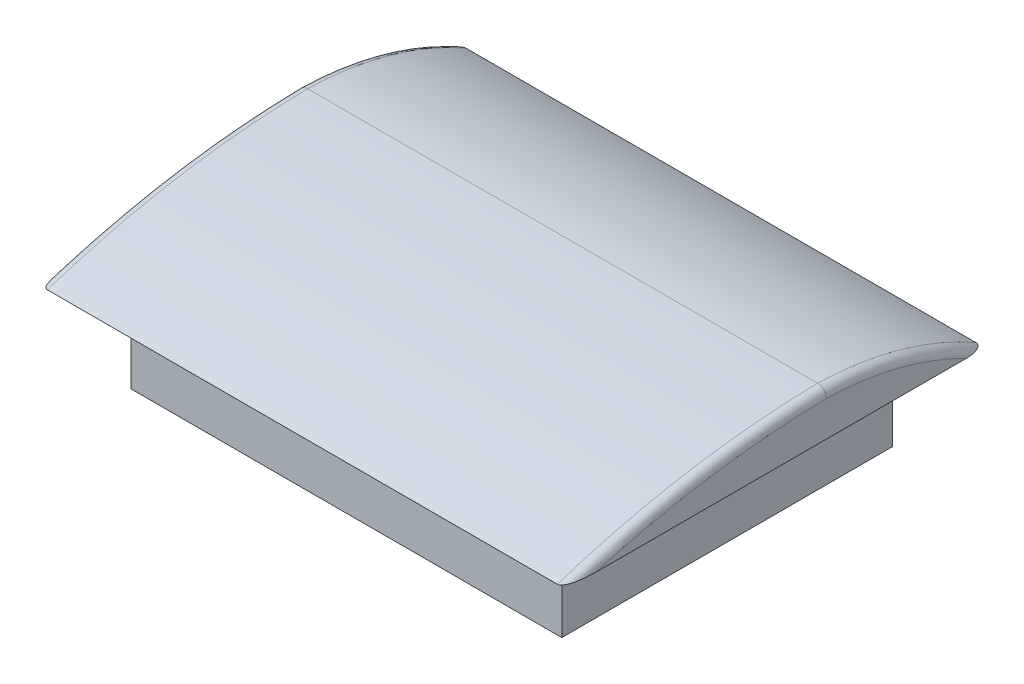
ISO-10303-21;
HEADER;
FILE_DESCRIPTION(('STEP AP214'),'2;1');
FILE_NAME('part.step','',(''),(''),'','','');
FILE_SCHEMA(('AUTOMOTIVE_DESIGN { 1 0 10303 214 1 1 1 1 }'));
ENDSEC;
DATA;
#1=APPLICATION_CONTEXT('core data for automotive mechanical design processes');
#2=APPLICATION_PROTOCOL_DEFINITION('international standard','automotive_design',2000,#1);
#3=PRODUCT_CONTEXT('',#1,'mechanical');
#4=PRODUCT('Part','Part','',(#3));
#5=PRODUCT_RELATED_PRODUCT_CATEGORY('part','',(#4));
#6=PRODUCT_DEFINITION_FORMATION('','',#4);
#7=PRODUCT_DEFINITION_CONTEXT('part definition',#1,'design');
#8=PRODUCT_DEFINITION('design','',#6,#7);
#9=PRODUCT_DEFINITION_SHAPE('','',#8);
#10=(LENGTH_UNIT() NAMED_UNIT(*) SI_UNIT(.MILLI.,.METRE.));
#11=(NAMED_UNIT(*) PLANE_ANGLE_UNIT() SI_UNIT($,.RADIAN.));
#12=(NAMED_UNIT(*) SI_UNIT($,.STERADIAN.) SOLID_ANGLE_UNIT());
#13=UNCERTAINTY_MEASURE_WITH_UNIT(LENGTH_MEASURE(1.E-05),#10,'distance_accuracy_value','');
#14=(GEOMETRIC_REPRESENTATION_CONTEXT(3) GLOBAL_UNCERTAINTY_ASSIGNED_CONTEXT((#13)) GLOBAL_UNIT_ASSIGNED_CONTEXT((#10,
#11,#12)) REPRESENTATION_CONTEXT('',''));
#15=CARTESIAN_POINT('',(0.,0.,0.));
#16=DIRECTION('',(0.,0.,1.));
#17=DIRECTION('',(1.,0.,0.));
#18=AXIS2_PLACEMENT_3D('',#15,#16,#17);
#19=CARTESIAN_POINT('',(-62.23,25.4,50.8));
#20=DIRECTION('',(1.,0.,0.));
#21=DIRECTION('',(0.,0.,-1.));
#22=AXIS2_PLACEMENT_3D('',#19,#20,#21);
#23=PLANE('',#22);
#24=DIRECTION('',(0.,0.,1.));
#25=VECTOR('',#24,1.);
#26=CARTESIAN_POINT('',(-62.23,0.,50.8));
#27=LINE('',#26,#25);
#28=CARTESIAN_POINT('',(-62.23,0.,-44.704));
#29=VERTEX_POINT('',#28);
#30=CARTESIAN_POINT('',(-62.23,0.,50.8));
#31=VERTEX_POINT('',#30);
#32=EDGE_CURVE('E218',#29,#31,#27,.T.);
#33=ORIENTED_EDGE('',*,*,#32,.T.);
#34=DIRECTION('',(0.,-1.,0.));
#35=VECTOR('',#34,1.);
#36=CARTESIAN_POINT('',(-62.23,25.4,50.8));
#37=LINE('',#36,#35);
#38=CARTESIAN_POINT('',(-62.23,25.4,50.8));
#39=VERTEX_POINT('',#38);
#40=EDGE_CURVE('E264',#39,#31,#37,.T.);
#41=ORIENTED_EDGE('',*,*,#40,.F.);
#42=DIRECTION('',(0.,0.,1.));
#43=VECTOR('',#42,1.);
#44=CARTESIAN_POINT('',(-62.23,25.4,50.8));
#45=LINE('',#44,#43);
#46=CARTESIAN_POINT('',(-62.23,25.4,-44.704));
#47=VERTEX_POINT('',#46);
#48=EDGE_CURVE('E224',#47,#39,#45,.T.);
#49=ORIENTED_EDGE('',*,*,#48,.F.);
#50=DIRECTION('',(0.,-1.,0.));
#51=VECTOR('',#50,1.);
#52=CARTESIAN_POINT('',(-62.23,25.4,-44.704));
#53=LINE('',#52,#51);
#54=EDGE_CURVE('E241',#47,#29,#53,.T.);
#55=ORIENTED_EDGE('',*,*,#54,.T.);
#56=EDGE_LOOP('',(#33,#41,#49,#55));
#57=FACE_BOUND('',#56,.T.);
#58=ADVANCED_FACE('F41',(#57),#23,.F.);
#59=CARTESIAN_POINT('',(-62.23,25.4,50.8));
#60=DIRECTION('',(0.,0.,-1.));
#61=DIRECTION('',(-1.,0.,0.));
#62=AXIS2_PLACEMENT_3D('',#59,#60,#61);
#63=PLANE('',#62);
#64=DIRECTION('',(1.,0.,0.));
#65=VECTOR('',#64,1.);
#66=CARTESIAN_POINT('',(-62.23,0.,50.8));
#67=LINE('',#66,#65);
#68=CARTESIAN_POINT('',(62.23,0.,50.8));
#69=VERTEX_POINT('',#68);
#70=EDGE_CURVE('E245',#31,#69,#67,.T.);
#71=ORIENTED_EDGE('',*,*,#70,.T.);
#72=DIRECTION('',(0.,-1.,0.));
#73=VECTOR('',#72,1.);
#74=CARTESIAN_POINT('',(62.23,25.4,50.8));
#75=LINE('',#74,#73);
#76=CARTESIAN_POINT('',(62.23,25.4,50.8));
#77=VERTEX_POINT('',#76);
#78=EDGE_CURVE('E260',#77,#69,#75,.T.);
#79=ORIENTED_EDGE('',*,*,#78,.F.);
#80=DIRECTION('',(1.,0.,0.));
#81=VECTOR('',#80,1.);
#82=CARTESIAN_POINT('',(-62.23,25.4,50.8));
#83=LINE('',#82,#81);
#84=EDGE_CURVE('E228',#39,#77,#83,.T.);
#85=ORIENTED_EDGE('',*,*,#84,.F.);
#86=ORIENTED_EDGE('',*,*,#40,.T.);
#87=EDGE_LOOP('',(#71,#79,#85,#86));
#88=FACE_BOUND('',#87,.T.);
#89=ADVANCED_FACE('F348',(#88),#63,.F.);
#90=CARTESIAN_POINT('',(62.23,25.4,50.8));
#91=DIRECTION('',(-1.,0.,0.));
#92=DIRECTION('',(0.,0.,1.));
#93=AXIS2_PLACEMENT_3D('',#90,#91,#92);
#94=PLANE('',#93);
#95=DIRECTION('',(0.,0.,-1.));
#96=VECTOR('',#95,1.);
#97=CARTESIAN_POINT('',(62.23,0.,50.8));
#98=LINE('',#97,#96);
#99=CARTESIAN_POINT('',(62.23,0.,-44.704));
#100=VERTEX_POINT('',#99);
#101=EDGE_CURVE('E248',#69,#100,#98,.T.);
#102=ORIENTED_EDGE('',*,*,#101,.T.);
#103=DIRECTION('',(0.,-1.,0.));
#104=VECTOR('',#103,1.);
#105=CARTESIAN_POINT('',(62.23,25.4,-44.704));
#106=LINE('',#105,#104);
#107=CARTESIAN_POINT('',(62.23,25.4,-44.704));
#108=VERTEX_POINT('',#107);
#109=EDGE_CURVE('E256',#108,#100,#106,.T.);
#110=ORIENTED_EDGE('',*,*,#109,.F.);
#111=DIRECTION('',(0.,0.,-1.));
#112=VECTOR('',#111,1.);
#113=CARTESIAN_POINT('',(62.23,25.4,50.8));
#114=LINE('',#113,#112);
#115=EDGE_CURVE('E233',#77,#108,#114,.T.);
#116=ORIENTED_EDGE('',*,*,#115,.F.);
#117=ORIENTED_EDGE('',*,*,#78,.T.);
#118=EDGE_LOOP('',(#102,#110,#116,#117));
#119=FACE_BOUND('',#118,.T.);
#120=ADVANCED_FACE('F353',(#119),#94,.F.);
#121=CARTESIAN_POINT('',(-62.23,25.4,-44.704));
#122=DIRECTION('',(0.,0.,1.));
#123=DIRECTION('',(1.,0.,0.));
#124=AXIS2_PLACEMENT_3D('',#121,#122,#123);
#125=PLANE('',#124);
#126=DIRECTION('',(-1.,0.,0.));
#127=VECTOR('',#126,1.);
#128=CARTESIAN_POINT('',(-62.23,0.,-44.704));
#129=LINE('',#128,#127);
#130=EDGE_CURVE('E229',#100,#29,#129,.T.);
#131=ORIENTED_EDGE('',*,*,#130,.T.);
#132=ORIENTED_EDGE('',*,*,#54,.F.);
#133=DIRECTION('',(-1.,0.,0.));
#134=VECTOR('',#133,1.);
#135=CARTESIAN_POINT('',(-62.23,25.4,-44.704));
#136=LINE('',#135,#134);
#137=EDGE_CURVE('E237',#108,#47,#136,.T.);
#138=ORIENTED_EDGE('',*,*,#137,.F.);
#139=ORIENTED_EDGE('',*,*,#109,.T.);
#140=EDGE_LOOP('',(#131,#132,#138,#139));
#141=FACE_BOUND('',#140,.T.);
#142=ADVANCED_FACE('F367',(#141),#125,.F.);
#143=CARTESIAN_POINT('',(0.,0.,0.));
#144=DIRECTION('',(0.,-1.,0.));
#145=DIRECTION('',(0.,0.,-1.));
#146=AXIS2_PLACEMENT_3D('',#143,#144,#145);
#147=PLANE('',#146);
#148=DIRECTION('',(0.,0.,-1.));
#149=VECTOR('',#148,1.);
#150=CARTESIAN_POINT('',(-57.15,0.,-39.624));
#151=LINE('',#150,#149);
#152=CARTESIAN_POINT('',(-57.15,0.,45.72));
#153=VERTEX_POINT('',#152);
#154=CARTESIAN_POINT('',(-57.15,0.,-39.624));
#155=VERTEX_POINT('',#154);
#156=EDGE_CURVE('E158',#153,#155,#151,.T.);
#157=ORIENTED_EDGE('',*,*,#156,.F.);
#158=DIRECTION('',(-1.,0.,0.));
#159=VECTOR('',#158,1.);
#160=CARTESIAN_POINT('',(-57.15,0.,45.72));
#161=LINE('',#160,#159);
#162=CARTESIAN_POINT('',(57.15,0.,45.72));
#163=VERTEX_POINT('',#162);
#164=EDGE_CURVE('E178',#163,#153,#161,.T.);
#165=ORIENTED_EDGE('',*,*,#164,.F.);
#166=DIRECTION('',(0.,0.,1.));
#167=VECTOR('',#166,1.);
#168=CARTESIAN_POINT('',(57.15,0.,-39.624));
#169=LINE('',#168,#167);
#170=CARTESIAN_POINT('',(57.15,0.,-39.624));
#171=VERTEX_POINT('',#170);
#172=EDGE_CURVE('E182',#171,#163,#169,.T.);
#173=ORIENTED_EDGE('',*,*,#172,.F.);
#174=DIRECTION('',(1.,0.,0.));
#175=VECTOR('',#174,1.);
#176=CARTESIAN_POINT('',(-57.15,0.,-39.624));
#177=LINE('',#176,#175);
#178=EDGE_CURVE('E191',#155,#171,#177,.T.);
#179=ORIENTED_EDGE('',*,*,#178,.F.);
#180=EDGE_LOOP('',(#157,#165,#173,#179));
#181=FACE_BOUND('',#180,.T.);
#182=ORIENTED_EDGE('',*,*,#32,.F.);
#183=ORIENTED_EDGE('',*,*,#130,.F.);
#184=ORIENTED_EDGE('',*,*,#101,.F.);
#185=ORIENTED_EDGE('',*,*,#70,.F.);
#186=EDGE_LOOP('',(#182,#183,#184,#185));
#187=FACE_BOUND('',#186,.T.);
#188=ADVANCED_FACE('F360',(#181,#187),#147,.T.);
#189=CARTESIAN_POINT('',(-76.2,-58.3114177789664,-9.52693950584267));
#190=DIRECTION('',(1.,0.,0.));
#191=DIRECTION('',(0.,0.,-1.));
#192=AXIS2_PLACEMENT_3D('',#189,#190,#191);
#193=CYLINDRICAL_SURFACE('',#192,96.4355452523905);
#194=DIRECTION('',(1.,0.,0.));
#195=VECTOR('',#194,1.);
#196=CARTESIAN_POINT('',(-76.2,25.4,-57.404));
#197=LINE('',#196,#195);
#198=CARTESIAN_POINT('',(-73.66,25.4,-57.404));
#199=VERTEX_POINT('',#198);
#200=CARTESIAN_POINT('',(73.6599999999999,25.4,-57.404));
#201=VERTEX_POINT('',#200);
#202=EDGE_CURVE('E214',#199,#201,#197,.T.);
#203=ORIENTED_EDGE('',*,*,#202,.F.);
#204=CARTESIAN_POINT('',(-73.66,-58.3114177789664,-9.52693950584267));
#205=DIRECTION('',(1.,0.,0.));
#206=DIRECTION('',(0.,0.,-1.));
#207=AXIS2_PLACEMENT_3D('',#204,#205,#206);
#208=CIRCLE('',#207,96.4355452523905);
#209=CARTESIAN_POINT('',(-73.66,38.1,-11.684));
#210=VERTEX_POINT('',#209);
#211=EDGE_CURVE('E318',#199,#210,#208,.T.);
#212=ORIENTED_EDGE('',*,*,#211,.T.);
#213=DIRECTION('',(1.,0.,0.));
#214=VECTOR('',#213,1.);
#215=CARTESIAN_POINT('',(-76.2,38.1,-11.684));
#216=LINE('',#215,#214);
#217=CARTESIAN_POINT('',(73.6599999999999,38.1,-11.684));
#218=VERTEX_POINT('',#217);
#219=EDGE_CURVE('E213',#210,#218,#216,.T.);
#220=ORIENTED_EDGE('',*,*,#219,.T.);
#221=CARTESIAN_POINT('',(73.66,-58.3114177789664,-9.52693950584267));
#222=DIRECTION('',(1.,0.,0.));
#223=DIRECTION('',(0.,0.,-1.));
#224=AXIS2_PLACEMENT_3D('',#221,#222,#223);
#225=CIRCLE('',#224,96.4355452523905);
#226=EDGE_CURVE('E321',#218,#201,#225,.F.);
#227=ORIENTED_EDGE('',*,*,#226,.T.);
#228=EDGE_LOOP('',(#203,#212,#220,#227));
#229=FACE_BOUND('',#228,.T.);
#230=ADVANCED_FACE('F378',(#229),#193,.T.);
#231=CARTESIAN_POINT('',(-76.2,25.4,0.));
#232=DIRECTION('',(0.,-1.,0.));
#233=DIRECTION('',(0.,0.,-1.));
#234=AXIS2_PLACEMENT_3D('',#231,#232,#233);
#235=PLANE('',#234);
#236=ORIENTED_EDGE('',*,*,#137,.T.);
#237=ORIENTED_EDGE('',*,*,#48,.T.);
#238=ORIENTED_EDGE('',*,*,#84,.T.);
#239=ORIENTED_EDGE('',*,*,#115,.T.);
#240=EDGE_LOOP('',(#236,#237,#238,#239));
#241=FACE_BOUND('',#240,.T.);
#242=DIRECTION('',(0.,0.,-1.));
#243=VECTOR('',#242,1.);
#244=CARTESIAN_POINT('',(-76.2,25.4,0.));
#245=LINE('',#244,#243);
#246=CARTESIAN_POINT('',(-76.2,25.4,54.9576947397605));
#247=VERTEX_POINT('',#246);
#248=CARTESIAN_POINT('',(-76.2,25.4,-52.056599176231));
#249=VERTEX_POINT('',#248);
#250=EDGE_CURVE('E209',#247,#249,#245,.T.);
#251=ORIENTED_EDGE('',*,*,#250,.T.);
#252=CARTESIAN_POINT('',(-76.2,25.4,-52.056599176231));
#253=CARTESIAN_POINT('',(-76.199986400252,25.4,-52.2032251436781));
#254=CARTESIAN_POINT('',(-76.1973943485337,25.4,-52.3498596987884));
#255=CARTESIAN_POINT('',(-76.1868281977685,25.4,-52.642975597477));
#256=CARTESIAN_POINT('',(-76.1788525506618,25.4,-52.7894568848455));
#257=CARTESIAN_POINT('',(-76.1572107693455,25.4,-53.0831382041237));
#258=CARTESIAN_POINT('',(-76.1435012678853,25.4,-53.2303350790349));
#259=CARTESIAN_POINT('',(-76.1100505742369,25.4,-53.5240330956672));
#260=CARTESIAN_POINT('',(-76.0903099536138,25.4,-53.6705343019809));
#261=CARTESIAN_POINT('',(-76.0440119410542,25.4,-53.964711740117));
#262=CARTESIAN_POINT('',(-76.0173569484839,25.4,-54.112372742644));
#263=CARTESIAN_POINT('',(-75.9567786041556,25.4,-54.4061931284965));
#264=CARTESIAN_POINT('',(-75.9228560845657,25.4,-54.5523526817391));
#265=CARTESIAN_POINT('',(-75.8470711129189,25.4,-54.8421354805129));
#266=CARTESIAN_POINT('',(-75.8052332376373,25.4,-54.985765111096));
#267=CARTESIAN_POINT('',(-75.7125493171576,25.4,-55.2700535580881));
#268=CARTESIAN_POINT('',(-75.6617082759858,25.4,-55.4107139764506));
#269=CARTESIAN_POINT('',(-75.5782479283947,25.4,-55.6171432916163));
#270=CARTESIAN_POINT('',(-75.5495628345286,25.4,-55.6845138663021));
#271=CARTESIAN_POINT('',(-75.4894993095836,25.4,-55.8180557300682));
#272=CARTESIAN_POINT('',(-75.4581206765914,25.4,-55.8842269287895));
#273=CARTESIAN_POINT('',(-75.3924515813571,25.4,-56.0151115340278));
#274=CARTESIAN_POINT('',(-75.3581613050162,25.4,-56.0798250332819));
#275=CARTESIAN_POINT('',(-75.2864125143503,25.4,-56.2074632544799));
#276=CARTESIAN_POINT('',(-75.2489540964619,25.4,-56.2703880307938));
#277=CARTESIAN_POINT('',(-75.1306901870741,25.4,-56.4570402151161));
#278=CARTESIAN_POINT('',(-75.0445599632672,25.4,-56.5774879256644));
#279=CARTESIAN_POINT('',(-74.8555384563441,25.4,-56.80448824619));
#280=CARTESIAN_POINT('',(-74.7526913753097,25.4,-56.911076200881));
#281=CARTESIAN_POINT('',(-74.5740283597699,25.4,-57.0625492670767));
#282=CARTESIAN_POINT('',(-74.5044808162744,25.4,-57.1147869775542));
#283=CARTESIAN_POINT('',(-74.358564110955,25.4,-57.208833796942));
#284=CARTESIAN_POINT('',(-74.2821997504608,25.4,-57.2506501684809));
#285=CARTESIAN_POINT('',(-74.1335053219032,25.4,-57.3162936437969));
#286=CARTESIAN_POINT('',(-74.0618922265332,25.4,-57.3417297979848));
#287=CARTESIAN_POINT('',(-73.9154627121127,25.4,-57.3802119967774));
#288=CARTESIAN_POINT('',(-73.8406549478061,25.4,-57.3932895415435));
#289=CARTESIAN_POINT('',(-73.7478599134495,25.4,-57.4010623531309));
#290=CARTESIAN_POINT('',(-73.7303006713412,25.4,-57.4021634293166));
#291=CARTESIAN_POINT('',(-73.6951629735922,25.4,-57.4036312489531));
#292=CARTESIAN_POINT('',(-73.6775845379439,25.4,-57.4039984707334));
#293=CARTESIAN_POINT('',(-73.66,25.4,-57.404));
#294=B_SPLINE_CURVE_WITH_KNOTS('',3,(#252,#253,#254,#255,#256,#257,#258,#259,#260,#261,#262,
#263,#264,#265,#266,#267,#268,#269,#270,#271,#272,#273,#274,#275,#276,#277,#278,#279,#280,#281,
#282,#283,#284,#285,#286,#287,#288,#289,#290,#291,#292,#293),.UNSPECIFIED.,.F.,.F.,(4,2,2,2,2,2,
2,2,2,2,2,2,2,2,2,2,2,2,2,2,4),(0.,0.439868125947527,0.879862790443707,1.3232472611938,
1.76658972572489,2.21656742173585,2.66649362056557,3.11504509152921,3.56334803230792,
3.782969266721,4.00260697880471,4.22223067809515,4.44184769455516,4.88492489793763,
5.32684904272928,5.58710271527851,5.84717450671704,6.0742570445478,6.30075921091763,
6.35353123589889,6.40626885261203),.UNSPECIFIED.);
#295=EDGE_CURVE('E325',#249,#199,#294,.T.);
#296=ORIENTED_EDGE('',*,*,#295,.T.);
#297=ORIENTED_EDGE('',*,*,#202,.T.);
#298=CARTESIAN_POINT('',(73.66,25.4,-57.404));
#299=CARTESIAN_POINT('',(73.6981578135602,25.4,-57.4040100133113));
#300=CARTESIAN_POINT('',(73.7362953719906,25.4,-57.4022668428809));
#301=CARTESIAN_POINT('',(73.8122237865294,25.4,-57.3953746143498));
#302=CARTESIAN_POINT('',(73.8500149534366,25.4,-57.3902289920787));
#303=CARTESIAN_POINT('',(73.9617123540981,25.4,-57.3699809738793));
#304=CARTESIAN_POINT('',(74.0347810984086,25.4,-57.3500625916669));
#305=CARTESIAN_POINT('',(74.1928935512286,25.4,-57.2932270381356));
#306=CARTESIAN_POINT('',(74.2769007446166,25.4,-57.2534814031969));
#307=CARTESIAN_POINT('',(74.4375749770849,25.4,-57.1608467940455));
#308=CARTESIAN_POINT('',(74.5142092051941,25.4,-57.1079025228635));
#309=CARTESIAN_POINT('',(74.6984022316067,25.4,-56.9616761791218));
#310=CARTESIAN_POINT('',(74.8007609899678,25.4,-56.8619070877978));
#311=CARTESIAN_POINT('',(74.9893610092658,25.4,-56.6483611657601));
#312=CARTESIAN_POINT('',(75.0755724348627,25.4,-56.5345590370428));
#313=CARTESIAN_POINT('',(75.2277443312366,25.4,-56.307833620905));
#314=CARTESIAN_POINT('',(75.2947940732708,25.4,-56.1956285659566));
#315=CARTESIAN_POINT('',(75.4191535263549,25.4,-55.9658883564525));
#316=CARTESIAN_POINT('',(75.4764548956137,25.4,-55.8483487449112));
#317=CARTESIAN_POINT('',(75.5828769635718,25.4,-55.6088801358254));
#318=CARTESIAN_POINT('',(75.6319504609353,25.4,-55.4869303859529));
#319=CARTESIAN_POINT('',(75.7225660382577,25.4,-55.2403314744805));
#320=CARTESIAN_POINT('',(75.7641104186081,25.4,-55.1156831504575));
#321=CARTESIAN_POINT('',(75.8387997774012,25.4,-54.8699890933601));
#322=CARTESIAN_POINT('',(75.8722373539281,25.4,-54.7490316314782));
#323=CARTESIAN_POINT('',(75.9335710932727,25.4,-54.5057143424611));
#324=CARTESIAN_POINT('',(75.9614663031451,25.4,-54.3833542779834));
#325=CARTESIAN_POINT('',(76.0375970032001,25.4,-54.0144069711077));
#326=CARTESIAN_POINT('',(76.0782020872765,25.4,-53.7662092800775));
#327=CARTESIAN_POINT('',(76.1253506722401,25.4,-53.3957433184515));
#328=CARTESIAN_POINT('',(76.1386775812198,25.4,-53.2742619445378));
#329=CARTESIAN_POINT('',(76.1613290762052,25.4,-53.0309125754713));
#330=CARTESIAN_POINT('',(76.1706535224922,25.4,-52.9090445669713));
#331=CARTESIAN_POINT('',(76.1854476665087,25.4,-52.6654602836386));
#332=CARTESIAN_POINT('',(76.1909292629109,25.4,-52.5437447157282));
#333=CARTESIAN_POINT('',(76.198202089274,25.4,-52.3002183812357));
#334=CARTESIAN_POINT('',(76.1999937922514,25.4,-52.1784076288585));
#335=CARTESIAN_POINT('',(76.2,25.4,-52.056599176231));
#336=B_SPLINE_CURVE_WITH_KNOTS('',3,(#298,#299,#300,#301,#302,#303,#304,#305,#306,#307,#308,
#309,#310,#311,#312,#313,#314,#315,#316,#317,#318,#319,#320,#321,#322,#323,#324,#325,#326,#327,
#328,#329,#330,#331,#332,#333,#334,#335),.UNSPECIFIED.,.F.,.F.,(4,2,2,2,2,2,2,2,2,2,2,2,2,2,2,2,
2,2,4),(0.,0.114396112422621,0.228676882568108,0.454758631639863,0.732050609988127,
1.01052445055201,1.43694029311188,1.86413641280985,2.25570507693637,2.64760714351683,
3.04168575955119,3.43564376794093,3.8119788814197,4.18837864544958,4.94197822442832,
5.30856744442403,5.67516946034139,6.04063128685684,6.40604626101452),.UNSPECIFIED.);
#337=CARTESIAN_POINT('',(76.2,25.4,-52.056599176231));
#338=VERTEX_POINT('',#337);
#339=EDGE_CURVE('E331',#201,#338,#336,.T.);
#340=ORIENTED_EDGE('',*,*,#339,.T.);
#341=DIRECTION('',(0.,0.,-1.));
#342=VECTOR('',#341,1.);
#343=CARTESIAN_POINT('',(76.2,25.4,0.));
#344=LINE('',#343,#342);
#345=CARTESIAN_POINT('',(76.2,25.4,54.9576947397605));
#346=VERTEX_POINT('',#345);
#347=EDGE_CURVE('E201',#346,#338,#344,.T.);
#348=ORIENTED_EDGE('',*,*,#347,.F.);
#349=CARTESIAN_POINT('',(76.2,25.4,54.9576947397605));
#350=CARTESIAN_POINT('',(76.1999885759621,25.4,55.1702436501355));
#351=CARTESIAN_POINT('',(76.1978797872232,25.4,55.3827965069229));
#352=CARTESIAN_POINT('',(76.1892823694804,25.4,55.8078322173067));
#353=CARTESIAN_POINT('',(76.1827933443078,25.4,56.0203150628315));
#354=CARTESIAN_POINT('',(76.1652297027602,25.4,56.4455925660413));
#355=CARTESIAN_POINT('',(76.1541443657316,25.4,56.6583867860074));
#356=CARTESIAN_POINT('',(76.1271089835265,25.4,57.0836617542742));
#357=CARTESIAN_POINT('',(76.1111590895933,25.4,57.2961425121143));
#358=CARTESIAN_POINT('',(76.0740125160216,25.4,57.7208165477305));
#359=CARTESIAN_POINT('',(76.0528117246593,25.4,57.9330094685626));
#360=CARTESIAN_POINT('',(76.0046802248743,25.4,58.3567431518603));
#361=CARTESIAN_POINT('',(75.9777497097168,25.4,58.5682839360787));
#362=CARTESIAN_POINT('',(75.9175306038124,25.4,58.9902668644826));
#363=CARTESIAN_POINT('',(75.8842478484157,25.4,59.2007098362795));
#364=CARTESIAN_POINT('',(75.8104316181484,25.4,59.6203064148014));
#365=CARTESIAN_POINT('',(75.7698993305218,25.4,59.8294602268567));
#366=CARTESIAN_POINT('',(75.7024438027673,25.4,60.1431287075725));
#367=CARTESIAN_POINT('',(75.6786804899952,25.4,60.2483270009152));
#368=CARTESIAN_POINT('',(75.6287549700014,25.4,60.4581592550192));
#369=CARTESIAN_POINT('',(75.6025926912144,25.4,60.5627931988465));
#370=CARTESIAN_POINT('',(75.5475727350394,25.4,60.7715170144663));
#371=CARTESIAN_POINT('',(75.5187111527849,25.4,60.8756058606412));
#372=CARTESIAN_POINT('',(75.4580032242066,25.4,61.0829092543534));
#373=CARTESIAN_POINT('',(75.4261569848941,25.4,61.1861238330919));
#374=CARTESIAN_POINT('',(75.3574381482308,25.4,61.3964539533553));
#375=CARTESIAN_POINT('',(75.3203962503435,25.4,61.5035145306347));
#376=CARTESIAN_POINT('',(75.2419791882399,25.4,61.7160340281226));
#377=CARTESIAN_POINT('',(75.2006045643444,25.4,61.8214931461705));
#378=CARTESIAN_POINT('',(75.1128123259959,25.4,62.0300050802125));
#379=CARTESIAN_POINT('',(75.0664072762172,25.4,62.1330631445721));
#380=CARTESIAN_POINT('',(74.9673888469489,25.4,62.3361243594517));
#381=CARTESIAN_POINT('',(74.9147792052577,25.4,62.4361293039915));
#382=CARTESIAN_POINT('',(74.8123383788938,25.4,62.6133697424288));
#383=CARTESIAN_POINT('',(74.7638301560643,25.4,62.6913636013542));
#384=CARTESIAN_POINT('',(74.6603489318277,25.4,62.8432567184776));
#385=CARTESIAN_POINT('',(74.6053628130353,25.4,62.9171472067416));
#386=CARTESIAN_POINT('',(74.4868141625115,25.4,63.0591906852645));
#387=CARTESIAN_POINT('',(74.4231645724876,25.4,63.127272249978));
#388=CARTESIAN_POINT('',(74.2858278917498,25.4,63.2525204570884));
#389=CARTESIAN_POINT('',(74.212180577264,25.4,63.3097282987095));
#390=CARTESIAN_POINT('',(74.0887884902367,25.4,63.384623406857));
#391=CARTESIAN_POINT('',(74.0428914512151,25.4,63.4085957970207));
#392=CARTESIAN_POINT('',(73.94797506664,25.4,63.4490499458659));
#393=CARTESIAN_POINT('',(73.8989667625271,25.4,63.4655566714939));
#394=CARTESIAN_POINT('',(73.8180396311888,25.4,63.4848629106736));
#395=CARTESIAN_POINT('',(73.7867848358013,25.4,63.4904919690281));
#396=CARTESIAN_POINT('',(73.7236990642095,25.4,63.4980819142688));
#397=CARTESIAN_POINT('',(73.6918661789874,25.4,63.5000268106364));
#398=CARTESIAN_POINT('',(73.66,25.4,63.5));
#399=B_SPLINE_CURVE_WITH_KNOTS('',3,(#349,#350,#351,#352,#353,#354,#355,#356,#357,#358,#359,
#360,#361,#362,#363,#364,#365,#366,#367,#368,#369,#370,#371,#372,#373,#374,#375,#376,#377,#378,
#379,#380,#381,#382,#383,#384,#385,#386,#387,#388,#389,#390,#391,#392,#393,#394,#395,#396,#397,
#398),.UNSPECIFIED.,.F.,.F.,(4,2,2,2,2,2,2,2,2,2,2,2,2,2,2,2,2,2,2,2,2,2,2,2,4),(0.,
0.637642318334456,1.27534231569374,1.91453815709046,2.55371412735974,3.19339219664114,
3.83304869282421,4.47212038608125,5.11108751529405,5.43461140571419,5.75814495055114,
6.08215398648028,6.40615140991259,6.74593530686044,7.08567688076609,7.42458861406196,
7.76329721160158,8.03861066923463,8.31449152707511,8.59338353616592,8.87119682044615,
9.02605078218894,9.18038297544767,9.2754529398474,9.37093460316864),.UNSPECIFIED.);
#400=CARTESIAN_POINT('',(73.6599999999999,25.4,63.5));
#401=VERTEX_POINT('',#400);
#402=EDGE_CURVE('E284',#346,#401,#399,.T.);
#403=ORIENTED_EDGE('',*,*,#402,.T.);
#404=DIRECTION('',(1.,0.,0.));
#405=VECTOR('',#404,1.);
#406=CARTESIAN_POINT('',(-76.2,25.4,63.5));
#407=LINE('',#406,#405);
#408=CARTESIAN_POINT('',(-73.66,25.4,63.5));
#409=VERTEX_POINT('',#408);
#410=EDGE_CURVE('E219',#409,#401,#407,.T.);
#411=ORIENTED_EDGE('',*,*,#410,.F.);
#412=CARTESIAN_POINT('',(-73.66,25.4,63.5));
#413=CARTESIAN_POINT('',(-73.686001831975,25.4,63.5000104322077));
#414=CARTESIAN_POINT('',(-73.7119865982051,25.4,63.4987220602511));
#415=CARTESIAN_POINT('',(-73.7636730962007,25.4,63.4936487191704));
#416=CARTESIAN_POINT('',(-73.7893751942586,25.4,63.4898675003575));
#417=CARTESIAN_POINT('',(-73.8650771865126,25.4,63.4750714042588));
#418=CARTESIAN_POINT('',(-73.9144237417868,25.4,63.4605977914649));
#419=CARTESIAN_POINT('',(-74.0219011738035,25.4,63.41939104958));
#420=CARTESIAN_POINT('',(-74.0791849836714,25.4,63.3905108104374));
#421=CARTESIAN_POINT('',(-74.1886523197346,25.4,63.3239494092417));
#422=CARTESIAN_POINT('',(-74.2408048450421,25.4,63.286218919957));
#423=CARTESIAN_POINT('',(-74.3332336245758,25.4,63.2102584963982));
#424=CARTESIAN_POINT('',(-74.3741591452351,25.4,63.1728003145108));
#425=CARTESIAN_POINT('',(-74.452660900567,25.4,63.0944955957782));
#426=CARTESIAN_POINT('',(-74.4902344322497,25.4,63.0536463747868));
#427=CARTESIAN_POINT('',(-74.5624627932959,25.4,62.9693633374942));
#428=CARTESIAN_POINT('',(-74.5971132224324,25.4,62.9259257868937));
#429=CARTESIAN_POINT('',(-74.6637985084472,25.4,62.8371230964416));
#430=CARTESIAN_POINT('',(-74.6958341611024,25.4,62.7917585494874));
#431=CARTESIAN_POINT('',(-74.7712149406399,25.4,62.6792337383744));
#432=CARTESIAN_POINT('',(-74.8133412322714,25.4,62.6112583157056));
#433=CARTESIAN_POINT('',(-74.8936573029222,25.4,62.4730075152327));
#434=CARTESIAN_POINT('',(-74.9318451776469,25.4,62.4027310462671));
#435=CARTESIAN_POINT('',(-75.0415258189808,25.4,62.1891237844757));
#436=CARTESIAN_POINT('',(-75.108005770887,25.4,62.0432186973898));
#437=CARTESIAN_POINT('',(-75.2315605686729,25.4,61.7457417031664));
#438=CARTESIAN_POINT('',(-75.2885254842678,25.4,61.5941254738162));
#439=CARTESIAN_POINT('',(-75.3942629639686,25.4,61.28826452817));
#440=CARTESIAN_POINT('',(-75.4430441212449,25.4,61.1340227586642));
#441=CARTESIAN_POINT('',(-75.5255167894764,25.4,60.8523403421761));
#442=CARTESIAN_POINT('',(-75.5603300655646,25.4,60.7252233170091));
#443=CARTESIAN_POINT('',(-75.6260851005085,25.4,60.4699889329476));
#444=CARTESIAN_POINT('',(-75.6570266348039,25.4,60.341871516488));
#445=CARTESIAN_POINT('',(-75.7447522053498,25.4,59.9562563085888));
#446=CARTESIAN_POINT('',(-75.7964110683644,25.4,59.6975875786299));
#447=CARTESIAN_POINT('',(-75.8886962105997,25.4,59.1775997289639));
#448=CARTESIAN_POINT('',(-75.9292915098415,25.4,58.9162752499065));
#449=CARTESIAN_POINT('',(-76.0009029735344,25.4,58.3923058766705));
#450=CARTESIAN_POINT('',(-76.0319183315429,25.4,58.1296608732199));
#451=CARTESIAN_POINT('',(-76.0833893796254,25.4,57.6242586264199));
#452=CARTESIAN_POINT('',(-76.104484666651,25.4,57.3815654212227));
#453=CARTESIAN_POINT('',(-76.1401350240305,25.4,56.8956868179857));
#454=CARTESIAN_POINT('',(-76.1546896719889,25.4,56.6525013891764));
#455=CARTESIAN_POINT('',(-76.1776446714649,25.4,56.1674228399021));
#456=CARTESIAN_POINT('',(-76.1860842628913,25.4,55.9255315477691));
#457=CARTESIAN_POINT('',(-76.1972517081439,25.4,55.4416561218343));
#458=CARTESIAN_POINT('',(-76.1999805086542,25.4,55.1996720100722));
#459=CARTESIAN_POINT('',(-76.2,25.4,54.9576947397605));
#460=B_SPLINE_CURVE_WITH_KNOTS('',3,(#412,#413,#414,#415,#416,#417,#418,#419,#420,#421,#422,
#423,#424,#425,#426,#427,#428,#429,#430,#431,#432,#433,#434,#435,#436,#437,#438,#439,#440,#441,
#442,#443,#444,#445,#446,#447,#448,#449,#450,#451,#452,#453,#454,#455,#456,#457,#458,#459),
.UNSPECIFIED.,.F.,.F.,(4,2,2,2,2,2,2,2,2,2,2,2,2,2,2,2,2,2,2,2,2,2,2,4),(0.,0.0779427523191566,
0.155768512061017,0.309204100317059,0.500599311931698,0.693087742124977,0.859291268747667,
1.02562763012473,1.19221007306121,1.35874162805655,1.59847698867468,1.83832772743808,
2.31875028379094,2.80438802441597,3.28951259642603,3.68484258685394,4.08019549573607,
4.87118789200619,5.66437296886327,6.45762479811549,7.18835675647822,7.91913589885043,
8.64518311738945,9.37110996873127),.UNSPECIFIED.);
#461=EDGE_CURVE('E275',#409,#247,#460,.T.);
#462=ORIENTED_EDGE('',*,*,#461,.T.);
#463=EDGE_LOOP('',(#251,#296,#297,#340,#348,#403,#411,#462));
#464=FACE_BOUND('',#463,.T.);
#465=ADVANCED_FACE('F290',(#241,#464),#235,.T.);
#466=CARTESIAN_POINT('',(-76.2,-215.864695209519,-15.9188066232295));
#467=DIRECTION('',(1.,0.,0.));
#468=DIRECTION('',(0.,0.,-1.));
#469=AXIS2_PLACEMENT_3D('',#466,#467,#468);
#470=CYLINDRICAL_SURFACE('',#469,254.);
#471=ORIENTED_EDGE('',*,*,#410,.T.);
#472=CARTESIAN_POINT('',(73.66,-215.864695209519,-15.9188066232295));
#473=DIRECTION('',(1.,0.,0.));
#474=DIRECTION('',(0.,0.,-1.));
#475=AXIS2_PLACEMENT_3D('',#472,#473,#474);
#476=CIRCLE('',#475,254.);
#477=EDGE_CURVE('E11',#401,#218,#476,.F.);
#478=ORIENTED_EDGE('',*,*,#477,.T.);
#479=ORIENTED_EDGE('',*,*,#219,.F.);
#480=CARTESIAN_POINT('',(-73.66,-215.864695209519,-15.9188066232295));
#481=DIRECTION('',(1.,0.,0.));
#482=DIRECTION('',(0.,0.,-1.));
#483=AXIS2_PLACEMENT_3D('',#480,#481,#482);
#484=CIRCLE('',#483,254.);
#485=EDGE_CURVE('E56',#210,#409,#484,.T.);
#486=ORIENTED_EDGE('',*,*,#485,.T.);
#487=EDGE_LOOP('',(#471,#478,#479,#486));
#488=FACE_BOUND('',#487,.T.);
#489=ADVANCED_FACE('F382',(#488),#470,.T.);
#490=CARTESIAN_POINT('',(-76.2,0.,0.));
#491=DIRECTION('',(1.,0.,0.));
#492=DIRECTION('',(0.,0.,-1.));
#493=AXIS2_PLACEMENT_3D('',#490,#491,#492);
#494=PLANE('',#493);
#495=CARTESIAN_POINT('',(-76.2,-215.864695209519,-15.9188066232295));
#496=DIRECTION('',(1.,0.,0.));
#497=DIRECTION('',(0.,0.,-1.));
#498=AXIS2_PLACEMENT_3D('',#495,#496,#497);
#499=CIRCLE('',#498,251.46);
#500=CARTESIAN_POINT('',(-76.2,35.55951787219,-11.6765576626668));
#501=VERTEX_POINT('',#500);
#502=EDGE_CURVE('E268',#247,#501,#499,.F.);
#503=ORIENTED_EDGE('',*,*,#502,.T.);
#504=CARTESIAN_POINT('',(-76.2,-58.3114177789664,-9.52693950584267));
#505=DIRECTION('',(1.,0.,0.));
#506=DIRECTION('',(0.,0.,-1.));
#507=AXIS2_PLACEMENT_3D('',#504,#505,#506);
#508=CIRCLE('',#507,93.8955452523905);
#509=EDGE_CURVE('E271',#501,#249,#508,.F.);
#510=ORIENTED_EDGE('',*,*,#509,.T.);
#511=ORIENTED_EDGE('',*,*,#250,.F.);
#512=EDGE_LOOP('',(#503,#510,#511));
#513=FACE_BOUND('',#512,.T.);
#514=ADVANCED_FACE('F384',(#513),#494,.F.);
#515=CARTESIAN_POINT('',(76.2,0.,0.));
#516=DIRECTION('',(1.,0.,0.));
#517=DIRECTION('',(0.,0.,-1.));
#518=AXIS2_PLACEMENT_3D('',#515,#516,#517);
#519=PLANE('',#518);
#520=ORIENTED_EDGE('',*,*,#347,.T.);
#521=CARTESIAN_POINT('',(76.2,-58.3114177789664,-9.52693950584267));
#522=DIRECTION('',(1.,0.,0.));
#523=DIRECTION('',(0.,0.,-1.));
#524=AXIS2_PLACEMENT_3D('',#521,#522,#523);
#525=CIRCLE('',#524,93.8955452523905);
#526=CARTESIAN_POINT('',(76.2,35.55951787219,-11.6765576626668));
#527=VERTEX_POINT('',#526);
#528=EDGE_CURVE('E64',#338,#527,#525,.T.);
#529=ORIENTED_EDGE('',*,*,#528,.T.);
#530=CARTESIAN_POINT('',(76.2,-215.864695209519,-15.9188066232295));
#531=DIRECTION('',(1.,0.,0.));
#532=DIRECTION('',(0.,0.,-1.));
#533=AXIS2_PLACEMENT_3D('',#530,#531,#532);
#534=CIRCLE('',#533,251.46);
#535=EDGE_CURVE('E315',#527,#346,#534,.T.);
#536=ORIENTED_EDGE('',*,*,#535,.T.);
#537=EDGE_LOOP('',(#520,#529,#536));
#538=FACE_BOUND('',#537,.T.);
#539=ADVANCED_FACE('F389',(#538),#519,.T.);
#540=CARTESIAN_POINT('',(-57.15,25.4,-39.624));
#541=DIRECTION('',(-1.,0.,0.));
#542=DIRECTION('',(0.,0.,1.));
#543=AXIS2_PLACEMENT_3D('',#540,#541,#542);
#544=PLANE('',#543);
#545=ORIENTED_EDGE('',*,*,#156,.T.);
#546=DIRECTION('',(0.,-1.,0.));
#547=VECTOR('',#546,1.);
#548=CARTESIAN_POINT('',(-57.15,25.4,-39.624));
#549=LINE('',#548,#547);
#550=CARTESIAN_POINT('',(-57.15,25.4,-39.624));
#551=VERTEX_POINT('',#550);
#552=EDGE_CURVE('E151',#551,#155,#549,.T.);
#553=ORIENTED_EDGE('',*,*,#552,.F.);
#554=DIRECTION('',(0.,0.,-1.));
#555=VECTOR('',#554,1.);
#556=CARTESIAN_POINT('',(-57.15,25.4,-39.624));
#557=LINE('',#556,#555);
#558=CARTESIAN_POINT('',(-57.15,25.4,45.72));
#559=VERTEX_POINT('',#558);
#560=EDGE_CURVE('E155',#559,#551,#557,.T.);
#561=ORIENTED_EDGE('',*,*,#560,.F.);
#562=DIRECTION('',(0.,-1.,0.));
#563=VECTOR('',#562,1.);
#564=CARTESIAN_POINT('',(-57.15,25.4,45.72));
#565=LINE('',#564,#563);
#566=EDGE_CURVE('E198',#559,#153,#565,.T.);
#567=ORIENTED_EDGE('',*,*,#566,.T.);
#568=EDGE_LOOP('',(#545,#553,#561,#567));
#569=FACE_BOUND('',#568,.T.);
#570=ADVANCED_FACE('F153',(#569),#544,.F.);
#571=CARTESIAN_POINT('',(-57.15,25.4,45.72));
#572=DIRECTION('',(0.,0.,1.));
#573=DIRECTION('',(1.,0.,0.));
#574=AXIS2_PLACEMENT_3D('',#571,#572,#573);
#575=PLANE('',#574);
#576=ORIENTED_EDGE('',*,*,#164,.T.);
#577=ORIENTED_EDGE('',*,*,#566,.F.);
#578=DIRECTION('',(-1.,0.,0.));
#579=VECTOR('',#578,1.);
#580=CARTESIAN_POINT('',(-57.15,25.4,45.72));
#581=LINE('',#580,#579);
#582=CARTESIAN_POINT('',(57.15,25.4,45.72));
#583=VERTEX_POINT('',#582);
#584=EDGE_CURVE('E164',#583,#559,#581,.T.);
#585=ORIENTED_EDGE('',*,*,#584,.F.);
#586=DIRECTION('',(0.,-1.,0.));
#587=VECTOR('',#586,1.);
#588=CARTESIAN_POINT('',(57.15,25.4,45.72));
#589=LINE('',#588,#587);
#590=EDGE_CURVE('E202',#583,#163,#589,.T.);
#591=ORIENTED_EDGE('',*,*,#590,.T.);
#592=EDGE_LOOP('',(#576,#577,#585,#591));
#593=FACE_BOUND('',#592,.T.);
#594=ADVANCED_FACE('F452',(#593),#575,.F.);
#595=CARTESIAN_POINT('',(57.15,25.4,-39.624));
#596=DIRECTION('',(1.,0.,0.));
#597=DIRECTION('',(0.,0.,-1.));
#598=AXIS2_PLACEMENT_3D('',#595,#596,#597);
#599=PLANE('',#598);
#600=ORIENTED_EDGE('',*,*,#172,.T.);
#601=ORIENTED_EDGE('',*,*,#590,.F.);
#602=DIRECTION('',(0.,0.,1.));
#603=VECTOR('',#602,1.);
#604=CARTESIAN_POINT('',(57.15,25.4,-39.624));
#605=LINE('',#604,#603);
#606=CARTESIAN_POINT('',(57.15,25.4,-39.624));
#607=VERTEX_POINT('',#606);
#608=EDGE_CURVE('E173',#607,#583,#605,.T.);
#609=ORIENTED_EDGE('',*,*,#608,.F.);
#610=DIRECTION('',(0.,-1.,0.));
#611=VECTOR('',#610,1.);
#612=CARTESIAN_POINT('',(57.15,25.4,-39.624));
#613=LINE('',#612,#611);
#614=EDGE_CURVE('E163',#607,#171,#613,.T.);
#615=ORIENTED_EDGE('',*,*,#614,.T.);
#616=EDGE_LOOP('',(#600,#601,#609,#615));
#617=FACE_BOUND('',#616,.T.);
#618=ADVANCED_FACE('F444',(#617),#599,.F.);
#619=CARTESIAN_POINT('',(-57.15,25.4,-39.624));
#620=DIRECTION('',(0.,0.,-1.));
#621=DIRECTION('',(-1.,0.,0.));
#622=AXIS2_PLACEMENT_3D('',#619,#620,#621);
#623=PLANE('',#622);
#624=ORIENTED_EDGE('',*,*,#178,.T.);
#625=ORIENTED_EDGE('',*,*,#614,.F.);
#626=DIRECTION('',(1.,0.,0.));
#627=VECTOR('',#626,1.);
#628=CARTESIAN_POINT('',(-57.15,25.4,-39.624));
#629=LINE('',#628,#627);
#630=EDGE_CURVE('E167',#551,#607,#629,.T.);
#631=ORIENTED_EDGE('',*,*,#630,.F.);
#632=ORIENTED_EDGE('',*,*,#552,.T.);
#633=EDGE_LOOP('',(#624,#625,#631,#632));
#634=FACE_BOUND('',#633,.T.);
#635=ADVANCED_FACE('F168',(#634),#623,.F.);
#636=CARTESIAN_POINT('',(0.,25.4,0.));
#637=DIRECTION('',(0.,1.,0.));
#638=DIRECTION('',(0.,0.,1.));
#639=AXIS2_PLACEMENT_3D('',#636,#637,#638);
#640=PLANE('',#639);
#641=ORIENTED_EDGE('',*,*,#560,.T.);
#642=ORIENTED_EDGE('',*,*,#630,.T.);
#643=ORIENTED_EDGE('',*,*,#608,.T.);
#644=ORIENTED_EDGE('',*,*,#584,.T.);
#645=EDGE_LOOP('',(#641,#642,#643,#644));
#646=FACE_BOUND('',#645,.T.);
#647=ADVANCED_FACE('F175',(#646),#640,.F.);
#648=CARTESIAN_POINT('',(-73.66,-215.864695209519,-15.9188066232295));
#649=DIRECTION('',(1.,0.,0.));
#650=DIRECTION('',(0.,0.,-1.));
#651=AXIS2_PLACEMENT_3D('',#648,#649,#650);
#652=TOROIDAL_SURFACE('',#651,251.46,2.54);
#653=ORIENTED_EDGE('',*,*,#461,.F.);
#654=ORIENTED_EDGE('',*,*,#485,.F.);
#655=CARTESIAN_POINT('',(-73.66,38.1,-11.684));
#656=CARTESIAN_POINT('',(-73.7314291978632,38.1000068525252,-11.6840000159194));
#657=CARTESIAN_POINT('',(-73.8028551448121,38.096986393926,-11.6839914163319));
#658=CARTESIAN_POINT('',(-73.9451959673482,38.0849438831316,-11.6839571110923));
#659=CARTESIAN_POINT('',(-74.0161108674085,38.0759221202848,-11.6839314062649));
#660=CARTESIAN_POINT('',(-74.1568832874351,38.0519383212271,-11.6838630391348));
#661=CARTESIAN_POINT('',(-74.2267415051367,38.0369803999236,-11.6838203885787));
#662=CARTESIAN_POINT('',(-74.364932443306,38.0012457495193,-11.6837184247974));
#663=CARTESIAN_POINT('',(-74.4332651822339,37.9804690908734,-11.683659111774));
#664=CARTESIAN_POINT('',(-74.635315228381,37.9095793192715,-11.6834565622078));
#665=CARTESIAN_POINT('',(-74.7661423192895,37.8508964838383,-11.6832886869716));
#666=CARTESIAN_POINT('',(-75.0159841832298,37.7124441151365,-11.6828915584931));
#667=CARTESIAN_POINT('',(-75.1350017618135,37.6326796067563,-11.6826623198767));
#668=CARTESIAN_POINT('',(-75.3579837963683,37.454297775435,-11.6821479689652));
#669=CARTESIAN_POINT('',(-75.4619478193662,37.3556799104193,-11.6818628550636));
#670=CARTESIAN_POINT('',(-75.6518789373771,37.1423552599127,-11.6812437447298));
#671=CARTESIAN_POINT('',(-75.7378397274699,37.0276428613562,-11.6809097312417));
#672=CARTESIAN_POINT('',(-75.8893216788921,36.7853746340159,-11.6802012970048));
#673=CARTESIAN_POINT('',(-75.9548329859693,36.6578126522812,-11.6798268568917));
#674=CARTESIAN_POINT('',(-76.0634552778666,36.3935584610974,-11.6790476169648));
#675=CARTESIAN_POINT('',(-76.1065874331226,36.2568750191386,-11.6786428462598));
#676=CARTESIAN_POINT('',(-76.1567155930145,36.034305755969,-11.6779806120214));
#677=CARTESIAN_POINT('',(-76.1712667883743,35.9500399573437,-11.6777291991089));
#678=CARTESIAN_POINT('',(-76.1918021493225,35.7805510926741,-11.6772220836507));
#679=CARTESIAN_POINT('',(-76.1977988741807,35.6953296155042,-11.6769663879524));
#680=CARTESIAN_POINT('',(-76.1998327192152,35.5932195863209,-11.6766591519332));
#681=CARTESIAN_POINT('',(-76.20000044731,35.576367535813,-11.6766084179559));
#682=CARTESIAN_POINT('',(-76.2,35.5595178721901,-11.6765576626682));
#683=B_SPLINE_CURVE_WITH_KNOTS('',3,(#655,#656,#657,#658,#659,#660,#661,#662,#663,#664,#665,
#666,#667,#668,#669,#670,#671,#672,#673,#674,#675,#676,#677,#678,#679,#680,#681,#682),
.UNSPECIFIED.,.F.,.F.,(4,2,2,2,2,2,2,2,2,2,2,2,2,4),(0.,0.214217891510493,0.428425455413493,
0.642484790628696,0.856541534062393,1.2844808480915,1.71231825317412,2.14016796135402,
2.56816725733688,2.99637248151897,3.4241718862157,3.68034351483466,3.93613865591275,
3.98669366740915),.UNSPECIFIED.);
#684=EDGE_CURVE('E192',#501,#210,#683,.F.);
#685=ORIENTED_EDGE('',*,*,#684,.F.);
#686=ORIENTED_EDGE('',*,*,#502,.F.);
#687=EDGE_LOOP('',(#653,#654,#685,#686));
#688=FACE_BOUND('',#687,.T.);
#689=ADVANCED_FACE('F294',(#688),#652,.T.);
#690=CARTESIAN_POINT('',(-73.66,-58.3114177789664,-9.52693950584267));
#691=DIRECTION('',(1.,0.,0.));
#692=DIRECTION('',(0.,0.,-1.));
#693=AXIS2_PLACEMENT_3D('',#690,#691,#692);
#694=TOROIDAL_SURFACE('',#693,93.8955452523905,2.54);
#695=ORIENTED_EDGE('',*,*,#684,.T.);
#696=ORIENTED_EDGE('',*,*,#211,.F.);
#697=ORIENTED_EDGE('',*,*,#295,.F.);
#698=ORIENTED_EDGE('',*,*,#509,.F.);
#699=EDGE_LOOP('',(#695,#696,#697,#698));
#700=FACE_BOUND('',#699,.T.);
#701=ADVANCED_FACE('F299',(#700),#694,.T.);
#702=CARTESIAN_POINT('',(73.66,-215.864695209519,-15.9188066232295));
#703=DIRECTION('',(1.,0.,0.));
#704=DIRECTION('',(0.,0.,-1.));
#705=AXIS2_PLACEMENT_3D('',#702,#703,#704);
#706=TOROIDAL_SURFACE('',#705,251.46,2.54);
#707=ORIENTED_EDGE('',*,*,#402,.F.);
#708=ORIENTED_EDGE('',*,*,#535,.F.);
#709=CARTESIAN_POINT('',(73.66,38.1,-11.684));
#710=CARTESIAN_POINT('',(73.7314291978632,38.1000068525252,-11.6840000159193));
#711=CARTESIAN_POINT('',(73.8028551448121,38.096986393926,-11.6839914163319));
#712=CARTESIAN_POINT('',(73.9451959673482,38.0849438831316,-11.6839571110924));
#713=CARTESIAN_POINT('',(74.0161108674085,38.0759221202848,-11.683931406265));
#714=CARTESIAN_POINT('',(74.1568832874351,38.0519383212271,-11.6838630391347));
#715=CARTESIAN_POINT('',(74.2267415051367,38.0369803999236,-11.6838203885783));
#716=CARTESIAN_POINT('',(74.3649324433061,38.0012457495193,-11.6837184247971));
#717=CARTESIAN_POINT('',(74.4332651822339,37.9804690908734,-11.6836591117739));
#718=CARTESIAN_POINT('',(74.635315228381,37.9095793192715,-11.683456562208));
#719=CARTESIAN_POINT('',(74.7661423192895,37.8508964838383,-11.6832886869717));
#720=CARTESIAN_POINT('',(75.0159841832298,37.7124441151365,-11.682891558493));
#721=CARTESIAN_POINT('',(75.1350017618135,37.6326796067563,-11.6826623198766));
#722=CARTESIAN_POINT('',(75.3579837963683,37.454297775435,-11.6821479689652));
#723=CARTESIAN_POINT('',(75.4619478193662,37.3556799104193,-11.6818628550636));
#724=CARTESIAN_POINT('',(75.651878937377,37.1423552599127,-11.6812437447298));
#725=CARTESIAN_POINT('',(75.7378397274699,37.0276428613562,-11.6809097312416));
#726=CARTESIAN_POINT('',(75.8893216788921,36.7853746340159,-11.6802012970048));
#727=CARTESIAN_POINT('',(75.9548329859693,36.6578126522812,-11.6798268568917));
#728=CARTESIAN_POINT('',(76.0634552778665,36.3935584610974,-11.6790476169648));
#729=CARTESIAN_POINT('',(76.1065874331226,36.2568750191386,-11.6786428462598));
#730=CARTESIAN_POINT('',(76.1567155930145,36.034305755969,-11.6779806120214));
#731=CARTESIAN_POINT('',(76.1712667883743,35.9500399573437,-11.6777291991089));
#732=CARTESIAN_POINT('',(76.1918021493225,35.7805510926741,-11.6772220836507));
#733=CARTESIAN_POINT('',(76.1977988741807,35.6953296155042,-11.6769663879524));
#734=CARTESIAN_POINT('',(76.1998327192152,35.5932195863209,-11.6766591519332));
#735=CARTESIAN_POINT('',(76.20000044731,35.576367535813,-11.6766084179559));
#736=CARTESIAN_POINT('',(76.2,35.5595178721901,-11.6765576626682));
#737=B_SPLINE_CURVE_WITH_KNOTS('',3,(#709,#710,#711,#712,#713,#714,#715,#716,#717,#718,#719,
#720,#721,#722,#723,#724,#725,#726,#727,#728,#729,#730,#731,#732,#733,#734,#735,#736),
.UNSPECIFIED.,.F.,.F.,(4,2,2,2,2,2,2,2,2,2,2,2,2,4),(0.,0.214217891510507,0.428425455413507,
0.642484790628737,0.856541534062394,1.2844808480915,1.71231825317412,2.14016796135402,
2.56816725733688,2.99637248151897,3.4241718862157,3.68034351483466,3.93613865591275,
3.98669366740915),.UNSPECIFIED.);
#738=EDGE_CURVE('E46',#218,#527,#737,.T.);
#739=ORIENTED_EDGE('',*,*,#738,.F.);
#740=ORIENTED_EDGE('',*,*,#477,.F.);
#741=EDGE_LOOP('',(#707,#708,#739,#740));
#742=FACE_BOUND('',#741,.T.);
#743=ADVANCED_FACE('F43',(#742),#706,.T.);
#744=CARTESIAN_POINT('',(73.66,-58.3114177789664,-9.52693950584267));
#745=DIRECTION('',(1.,0.,0.));
#746=DIRECTION('',(0.,0.,-1.));
#747=AXIS2_PLACEMENT_3D('',#744,#745,#746);
#748=TOROIDAL_SURFACE('',#747,93.8955452523905,2.54);
#749=ORIENTED_EDGE('',*,*,#738,.T.);
#750=ORIENTED_EDGE('',*,*,#528,.F.);
#751=ORIENTED_EDGE('',*,*,#339,.F.);
#752=ORIENTED_EDGE('',*,*,#226,.F.);
#753=EDGE_LOOP('',(#749,#750,#751,#752));
#754=FACE_BOUND('',#753,.T.);
#755=ADVANCED_FACE('F337',(#754),#748,.T.);
#756=CLOSED_SHELL('',(#58,#89,#120,#142,#188,#230,#465,#489,#514,#539,#570,#594,#618,#635,#647,
#689,#701,#743,#755));
#757=MANIFOLD_SOLID_BREP('B2',#756);
#758=ADVANCED_BREP_SHAPE_REPRESENTATION('',(#18,#757),#14);
#759=SHAPE_DEFINITION_REPRESENTATION(#9,#758);
ENDSEC;
END-ISO-10303-21;
